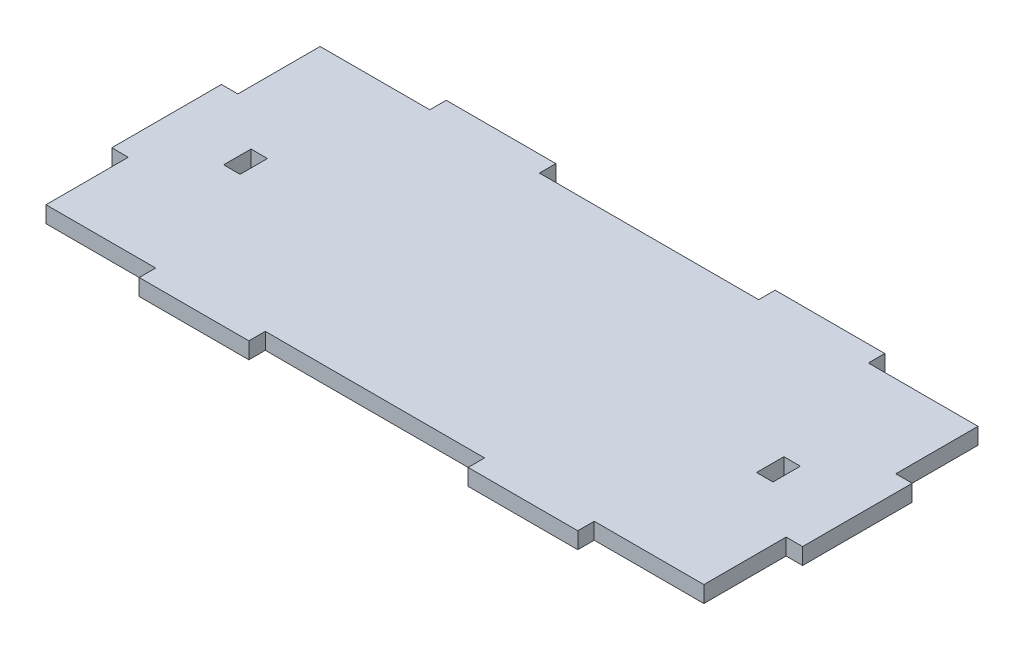
ISO-10303-21;
HEADER;
FILE_DESCRIPTION(('STEP AP214'),'2;1');
FILE_NAME('part.step','',(''),(''),'','','');
FILE_SCHEMA(('AUTOMOTIVE_DESIGN { 1 0 10303 214 1 1 1 1 }'));
ENDSEC;
DATA;
#1=APPLICATION_CONTEXT('core data for automotive mechanical design processes');
#2=APPLICATION_PROTOCOL_DEFINITION('international standard','automotive_design',2000,#1);
#3=PRODUCT_CONTEXT('',#1,'mechanical');
#4=PRODUCT('Part','Part','',(#3));
#5=PRODUCT_RELATED_PRODUCT_CATEGORY('part','',(#4));
#6=PRODUCT_DEFINITION_FORMATION('','',#4);
#7=PRODUCT_DEFINITION_CONTEXT('part definition',#1,'design');
#8=PRODUCT_DEFINITION('design','',#6,#7);
#9=PRODUCT_DEFINITION_SHAPE('','',#8);
#10=(LENGTH_UNIT() NAMED_UNIT(*) SI_UNIT(.MILLI.,.METRE.));
#11=(NAMED_UNIT(*) PLANE_ANGLE_UNIT() SI_UNIT($,.RADIAN.));
#12=(NAMED_UNIT(*) SI_UNIT($,.STERADIAN.) SOLID_ANGLE_UNIT());
#13=UNCERTAINTY_MEASURE_WITH_UNIT(LENGTH_MEASURE(1.E-05),#10,'distance_accuracy_value','');
#14=(GEOMETRIC_REPRESENTATION_CONTEXT(3) GLOBAL_UNCERTAINTY_ASSIGNED_CONTEXT((#13)) GLOBAL_UNIT_ASSIGNED_CONTEXT((#10,
#11,#12)) REPRESENTATION_CONTEXT('',''));
#15=CARTESIAN_POINT('',(0.,0.,0.));
#16=DIRECTION('',(0.,0.,1.));
#17=DIRECTION('',(1.,0.,0.));
#18=AXIS2_PLACEMENT_3D('',#15,#16,#17);
#19=CARTESIAN_POINT('',(0.,3.,0.));
#20=DIRECTION('',(0.,1.,0.));
#21=DIRECTION('',(0.,0.,1.));
#22=AXIS2_PLACEMENT_3D('',#19,#20,#21);
#23=PLANE('',#22);
#24=DIRECTION('',(0.,0.,1.));
#25=VECTOR('',#24,1.);
#26=CARTESIAN_POINT('',(0.,3.,0.));
#27=LINE('',#26,#25);
#28=CARTESIAN_POINT('',(0.,3.,-15.));
#29=VERTEX_POINT('',#28);
#30=CARTESIAN_POINT('',(0.,3.,0.));
#31=VERTEX_POINT('',#30);
#32=EDGE_CURVE('E339',#29,#31,#27,.T.);
#33=ORIENTED_EDGE('',*,*,#32,.T.);
#34=DIRECTION('',(1.,0.,0.));
#35=VECTOR('',#34,1.);
#36=CARTESIAN_POINT('',(0.,3.,0.));
#37=LINE('',#36,#35);
#38=CARTESIAN_POINT('',(20.,3.,0.));
#39=VERTEX_POINT('',#38);
#40=EDGE_CURVE('E342',#31,#39,#37,.T.);
#41=ORIENTED_EDGE('',*,*,#40,.T.);
#42=DIRECTION('',(0.,0.,1.));
#43=VECTOR('',#42,1.);
#44=CARTESIAN_POINT('',(20.,3.,3.00000000000001));
#45=LINE('',#44,#43);
#46=CARTESIAN_POINT('',(20.,3.,3.00000000000001));
#47=VERTEX_POINT('',#46);
#48=EDGE_CURVE('E345',#39,#47,#45,.T.);
#49=ORIENTED_EDGE('',*,*,#48,.T.);
#50=DIRECTION('',(1.,0.,0.));
#51=VECTOR('',#50,1.);
#52=CARTESIAN_POINT('',(20.,3.,3.00000000000001));
#53=LINE('',#52,#51);
#54=CARTESIAN_POINT('',(40.,3.,3.00000000000001));
#55=VERTEX_POINT('',#54);
#56=EDGE_CURVE('E347',#47,#55,#53,.T.);
#57=ORIENTED_EDGE('',*,*,#56,.T.);
#58=DIRECTION('',(0.,0.,-1.));
#59=VECTOR('',#58,1.);
#60=CARTESIAN_POINT('',(40.,3.,3.00000000000001));
#61=LINE('',#60,#59);
#62=CARTESIAN_POINT('',(40.,3.,0.));
#63=VERTEX_POINT('',#62);
#64=EDGE_CURVE('E349',#55,#63,#61,.T.);
#65=ORIENTED_EDGE('',*,*,#64,.T.);
#66=DIRECTION('',(1.,0.,0.));
#67=VECTOR('',#66,1.);
#68=CARTESIAN_POINT('',(40.,3.,0.));
#69=LINE('',#68,#67);
#70=CARTESIAN_POINT('',(80.,3.,0.));
#71=VERTEX_POINT('',#70);
#72=EDGE_CURVE('E351',#63,#71,#69,.T.);
#73=ORIENTED_EDGE('',*,*,#72,.T.);
#74=DIRECTION('',(0.,0.,1.));
#75=VECTOR('',#74,1.);
#76=CARTESIAN_POINT('',(80.,3.,3.00000000000001));
#77=LINE('',#76,#75);
#78=CARTESIAN_POINT('',(80.,3.,3.00000000000001));
#79=VERTEX_POINT('',#78);
#80=EDGE_CURVE('E353',#71,#79,#77,.T.);
#81=ORIENTED_EDGE('',*,*,#80,.T.);
#82=DIRECTION('',(1.,0.,0.));
#83=VECTOR('',#82,1.);
#84=CARTESIAN_POINT('',(100.,3.,3.00000000000001));
#85=LINE('',#84,#83);
#86=CARTESIAN_POINT('',(100.,3.,3.00000000000001));
#87=VERTEX_POINT('',#86);
#88=EDGE_CURVE('E355',#79,#87,#85,.T.);
#89=ORIENTED_EDGE('',*,*,#88,.T.);
#90=DIRECTION('',(0.,0.,-1.));
#91=VECTOR('',#90,1.);
#92=CARTESIAN_POINT('',(100.,3.,3.00000000000001));
#93=LINE('',#92,#91);
#94=CARTESIAN_POINT('',(100.,3.,0.));
#95=VERTEX_POINT('',#94);
#96=EDGE_CURVE('E357',#87,#95,#93,.T.);
#97=ORIENTED_EDGE('',*,*,#96,.T.);
#98=DIRECTION('',(1.,0.,0.));
#99=VECTOR('',#98,1.);
#100=CARTESIAN_POINT('',(100.,3.,0.));
#101=LINE('',#100,#99);
#102=CARTESIAN_POINT('',(120.,3.,0.));
#103=VERTEX_POINT('',#102);
#104=EDGE_CURVE('E359',#95,#103,#101,.T.);
#105=ORIENTED_EDGE('',*,*,#104,.T.);
#106=DIRECTION('',(0.,0.,-1.));
#107=VECTOR('',#106,1.);
#108=CARTESIAN_POINT('',(120.,3.,0.));
#109=LINE('',#108,#107);
#110=CARTESIAN_POINT('',(120.,3.,-15.));
#111=VERTEX_POINT('',#110);
#112=EDGE_CURVE('E361',#103,#111,#109,.T.);
#113=ORIENTED_EDGE('',*,*,#112,.T.);
#114=DIRECTION('',(1.,0.,0.));
#115=VECTOR('',#114,1.);
#116=CARTESIAN_POINT('',(120.,3.,-15.));
#117=LINE('',#116,#115);
#118=CARTESIAN_POINT('',(123.,3.,-15.));
#119=VERTEX_POINT('',#118);
#120=EDGE_CURVE('E363',#111,#119,#117,.T.);
#121=ORIENTED_EDGE('',*,*,#120,.T.);
#122=DIRECTION('',(0.,0.,-1.));
#123=VECTOR('',#122,1.);
#124=CARTESIAN_POINT('',(123.,3.,-15.));
#125=LINE('',#124,#123);
#126=CARTESIAN_POINT('',(123.,3.,-35.));
#127=VERTEX_POINT('',#126);
#128=EDGE_CURVE('E365',#119,#127,#125,.T.);
#129=ORIENTED_EDGE('',*,*,#128,.T.);
#130=DIRECTION('',(-1.,0.,0.));
#131=VECTOR('',#130,1.);
#132=CARTESIAN_POINT('',(120.,3.,-35.));
#133=LINE('',#132,#131);
#134=CARTESIAN_POINT('',(120.,3.,-35.));
#135=VERTEX_POINT('',#134);
#136=EDGE_CURVE('E367',#127,#135,#133,.T.);
#137=ORIENTED_EDGE('',*,*,#136,.T.);
#138=DIRECTION('',(0.,0.,-1.));
#139=VECTOR('',#138,1.);
#140=CARTESIAN_POINT('',(120.,3.,-35.));
#141=LINE('',#140,#139);
#142=CARTESIAN_POINT('',(120.,3.,-50.));
#143=VERTEX_POINT('',#142);
#144=EDGE_CURVE('E369',#135,#143,#141,.T.);
#145=ORIENTED_EDGE('',*,*,#144,.T.);
#146=DIRECTION('',(-1.,0.,0.));
#147=VECTOR('',#146,1.);
#148=CARTESIAN_POINT('',(100.,3.,-50.));
#149=LINE('',#148,#147);
#150=CARTESIAN_POINT('',(100.,3.,-50.));
#151=VERTEX_POINT('',#150);
#152=EDGE_CURVE('E371',#143,#151,#149,.T.);
#153=ORIENTED_EDGE('',*,*,#152,.T.);
#154=DIRECTION('',(0.,0.,-1.));
#155=VECTOR('',#154,1.);
#156=CARTESIAN_POINT('',(100.,3.,-53.));
#157=LINE('',#156,#155);
#158=CARTESIAN_POINT('',(100.,3.,-53.));
#159=VERTEX_POINT('',#158);
#160=EDGE_CURVE('E373',#151,#159,#157,.T.);
#161=ORIENTED_EDGE('',*,*,#160,.T.);
#162=DIRECTION('',(-1.,0.,0.));
#163=VECTOR('',#162,1.);
#164=CARTESIAN_POINT('',(100.,3.,-53.));
#165=LINE('',#164,#163);
#166=CARTESIAN_POINT('',(80.,3.,-53.));
#167=VERTEX_POINT('',#166);
#168=EDGE_CURVE('E375',#159,#167,#165,.T.);
#169=ORIENTED_EDGE('',*,*,#168,.T.);
#170=DIRECTION('',(0.,0.,1.));
#171=VECTOR('',#170,1.);
#172=CARTESIAN_POINT('',(80.,3.,-53.));
#173=LINE('',#172,#171);
#174=CARTESIAN_POINT('',(80.,3.,-50.));
#175=VERTEX_POINT('',#174);
#176=EDGE_CURVE('E377',#167,#175,#173,.T.);
#177=ORIENTED_EDGE('',*,*,#176,.T.);
#178=DIRECTION('',(-1.,0.,0.));
#179=VECTOR('',#178,1.);
#180=CARTESIAN_POINT('',(40.,3.,-50.));
#181=LINE('',#180,#179);
#182=CARTESIAN_POINT('',(40.,3.,-50.));
#183=VERTEX_POINT('',#182);
#184=EDGE_CURVE('E379',#175,#183,#181,.T.);
#185=ORIENTED_EDGE('',*,*,#184,.T.);
#186=DIRECTION('',(0.,0.,-1.));
#187=VECTOR('',#186,1.);
#188=CARTESIAN_POINT('',(40.,3.,-53.));
#189=LINE('',#188,#187);
#190=CARTESIAN_POINT('',(40.,3.,-53.));
#191=VERTEX_POINT('',#190);
#192=EDGE_CURVE('E381',#183,#191,#189,.T.);
#193=ORIENTED_EDGE('',*,*,#192,.T.);
#194=DIRECTION('',(-1.,0.,0.));
#195=VECTOR('',#194,1.);
#196=CARTESIAN_POINT('',(20.,3.,-53.));
#197=LINE('',#196,#195);
#198=CARTESIAN_POINT('',(20.,3.,-53.));
#199=VERTEX_POINT('',#198);
#200=EDGE_CURVE('E383',#191,#199,#197,.T.);
#201=ORIENTED_EDGE('',*,*,#200,.T.);
#202=DIRECTION('',(0.,0.,1.));
#203=VECTOR('',#202,1.);
#204=CARTESIAN_POINT('',(20.,3.,-53.));
#205=LINE('',#204,#203);
#206=CARTESIAN_POINT('',(20.,3.,-50.));
#207=VERTEX_POINT('',#206);
#208=EDGE_CURVE('E385',#199,#207,#205,.T.);
#209=ORIENTED_EDGE('',*,*,#208,.T.);
#210=DIRECTION('',(-1.,0.,0.));
#211=VECTOR('',#210,1.);
#212=CARTESIAN_POINT('',(0.,3.,-50.));
#213=LINE('',#212,#211);
#214=CARTESIAN_POINT('',(0.,3.,-50.));
#215=VERTEX_POINT('',#214);
#216=EDGE_CURVE('E387',#207,#215,#213,.T.);
#217=ORIENTED_EDGE('',*,*,#216,.T.);
#218=DIRECTION('',(0.,0.,1.));
#219=VECTOR('',#218,1.);
#220=CARTESIAN_POINT('',(0.,3.,-35.));
#221=LINE('',#220,#219);
#222=CARTESIAN_POINT('',(0.,3.,-35.));
#223=VERTEX_POINT('',#222);
#224=EDGE_CURVE('E389',#215,#223,#221,.T.);
#225=ORIENTED_EDGE('',*,*,#224,.T.);
#226=DIRECTION('',(-1.,0.,0.));
#227=VECTOR('',#226,1.);
#228=CARTESIAN_POINT('',(0.,3.,-35.));
#229=LINE('',#228,#227);
#230=CARTESIAN_POINT('',(-3.,3.,-35.));
#231=VERTEX_POINT('',#230);
#232=EDGE_CURVE('E391',#223,#231,#229,.T.);
#233=ORIENTED_EDGE('',*,*,#232,.T.);
#234=DIRECTION('',(0.,0.,1.));
#235=VECTOR('',#234,1.);
#236=CARTESIAN_POINT('',(-3.,3.,-15.));
#237=LINE('',#236,#235);
#238=CARTESIAN_POINT('',(-3.,3.,-15.));
#239=VERTEX_POINT('',#238);
#240=EDGE_CURVE('E393',#231,#239,#237,.T.);
#241=ORIENTED_EDGE('',*,*,#240,.T.);
#242=DIRECTION('',(1.,0.,0.));
#243=VECTOR('',#242,1.);
#244=CARTESIAN_POINT('',(0.,3.,-15.));
#245=LINE('',#244,#243);
#246=EDGE_CURVE('E395',#239,#29,#245,.T.);
#247=ORIENTED_EDGE('',*,*,#246,.T.);
#248=EDGE_LOOP('',(#33,#41,#49,#57,#65,#73,#81,#89,#97,#105,#113,#121,#129,#137,#145,#153,#161,
#169,#177,#185,#193,#201,#209,#217,#225,#233,#241,#247));
#249=FACE_BOUND('',#248,.T.);
#250=DIRECTION('',(-1.,0.,0.));
#251=VECTOR('',#250,1.);
#252=CARTESIAN_POINT('',(9.9,3.,-27.5));
#253=LINE('',#252,#251);
#254=CARTESIAN_POINT('',(12.9,3.,-27.5));
#255=VERTEX_POINT('',#254);
#256=CARTESIAN_POINT('',(9.9,3.,-27.5));
#257=VERTEX_POINT('',#256);
#258=EDGE_CURVE('E310',#255,#257,#253,.T.);
#259=ORIENTED_EDGE('',*,*,#258,.F.);
#260=DIRECTION('',(0.,0.,-1.));
#261=VECTOR('',#260,1.);
#262=CARTESIAN_POINT('',(12.9,3.,-27.5));
#263=LINE('',#262,#261);
#264=CARTESIAN_POINT('',(12.9,3.,-22.5));
#265=VERTEX_POINT('',#264);
#266=EDGE_CURVE('E308',#265,#255,#263,.T.);
#267=ORIENTED_EDGE('',*,*,#266,.F.);
#268=DIRECTION('',(1.,0.,0.));
#269=VECTOR('',#268,1.);
#270=CARTESIAN_POINT('',(9.9,3.,-22.5));
#271=LINE('',#270,#269);
#272=CARTESIAN_POINT('',(9.9,3.,-22.5));
#273=VERTEX_POINT('',#272);
#274=EDGE_CURVE('E316',#273,#265,#271,.T.);
#275=ORIENTED_EDGE('',*,*,#274,.F.);
#276=DIRECTION('',(0.,0.,1.));
#277=VECTOR('',#276,1.);
#278=CARTESIAN_POINT('',(9.9,3.,-27.5));
#279=LINE('',#278,#277);
#280=EDGE_CURVE('E313',#257,#273,#279,.T.);
#281=ORIENTED_EDGE('',*,*,#280,.F.);
#282=EDGE_LOOP('',(#259,#267,#275,#281));
#283=FACE_BOUND('',#282,.T.);
#284=DIRECTION('',(-1.,0.,0.));
#285=VECTOR('',#284,1.);
#286=CARTESIAN_POINT('',(110.1,3.,-27.5));
#287=LINE('',#286,#285);
#288=CARTESIAN_POINT('',(110.1,3.,-27.5));
#289=VERTEX_POINT('',#288);
#290=CARTESIAN_POINT('',(107.1,3.,-27.5));
#291=VERTEX_POINT('',#290);
#292=EDGE_CURVE('E280',#289,#291,#287,.T.);
#293=ORIENTED_EDGE('',*,*,#292,.F.);
#294=DIRECTION('',(0.,0.,-1.));
#295=VECTOR('',#294,1.);
#296=CARTESIAN_POINT('',(110.1,3.,-27.5));
#297=LINE('',#296,#295);
#298=CARTESIAN_POINT('',(110.1,3.,-22.5));
#299=VERTEX_POINT('',#298);
#300=EDGE_CURVE('E272',#299,#289,#297,.T.);
#301=ORIENTED_EDGE('',*,*,#300,.F.);
#302=DIRECTION('',(1.,0.,0.));
#303=VECTOR('',#302,1.);
#304=CARTESIAN_POINT('',(110.1,3.,-22.5));
#305=LINE('',#304,#303);
#306=CARTESIAN_POINT('',(107.1,3.,-22.5));
#307=VERTEX_POINT('',#306);
#308=EDGE_CURVE('E294',#307,#299,#305,.T.);
#309=ORIENTED_EDGE('',*,*,#308,.F.);
#310=DIRECTION('',(0.,0.,1.));
#311=VECTOR('',#310,1.);
#312=CARTESIAN_POINT('',(107.1,3.,-27.5));
#313=LINE('',#312,#311);
#314=EDGE_CURVE('E292',#291,#307,#313,.T.);
#315=ORIENTED_EDGE('',*,*,#314,.F.);
#316=EDGE_LOOP('',(#293,#301,#309,#315));
#317=FACE_BOUND('',#316,.T.);
#318=ADVANCED_FACE('F39',(#249,#283,#317),#23,.T.);
#319=CARTESIAN_POINT('',(0.,0.,0.));
#320=DIRECTION('',(0.,1.,0.));
#321=DIRECTION('',(0.,0.,1.));
#322=AXIS2_PLACEMENT_3D('',#319,#320,#321);
#323=PLANE('',#322);
#324=DIRECTION('',(0.,0.,-1.));
#325=VECTOR('',#324,1.);
#326=CARTESIAN_POINT('',(12.9,0.,-27.5));
#327=LINE('',#326,#325);
#328=CARTESIAN_POINT('',(12.9,0.,-22.5));
#329=VERTEX_POINT('',#328);
#330=CARTESIAN_POINT('',(12.9,0.,-27.5));
#331=VERTEX_POINT('',#330);
#332=EDGE_CURVE('E288',#329,#331,#327,.T.);
#333=ORIENTED_EDGE('',*,*,#332,.T.);
#334=DIRECTION('',(-1.,0.,0.));
#335=VECTOR('',#334,1.);
#336=CARTESIAN_POINT('',(9.9,0.,-27.5));
#337=LINE('',#336,#335);
#338=CARTESIAN_POINT('',(9.9,0.,-27.5));
#339=VERTEX_POINT('',#338);
#340=EDGE_CURVE('E321',#331,#339,#337,.T.);
#341=ORIENTED_EDGE('',*,*,#340,.T.);
#342=DIRECTION('',(0.,0.,1.));
#343=VECTOR('',#342,1.);
#344=CARTESIAN_POINT('',(9.9,0.,-27.5));
#345=LINE('',#344,#343);
#346=CARTESIAN_POINT('',(9.9,0.,-22.5));
#347=VERTEX_POINT('',#346);
#348=EDGE_CURVE('E324',#339,#347,#345,.T.);
#349=ORIENTED_EDGE('',*,*,#348,.T.);
#350=DIRECTION('',(1.,0.,0.));
#351=VECTOR('',#350,1.);
#352=CARTESIAN_POINT('',(9.9,0.,-22.5));
#353=LINE('',#352,#351);
#354=EDGE_CURVE('E311',#347,#329,#353,.T.);
#355=ORIENTED_EDGE('',*,*,#354,.T.);
#356=EDGE_LOOP('',(#333,#341,#349,#355));
#357=FACE_BOUND('',#356,.T.);
#358=DIRECTION('',(0.,0.,1.));
#359=VECTOR('',#358,1.);
#360=CARTESIAN_POINT('',(0.,0.,0.));
#361=LINE('',#360,#359);
#362=CARTESIAN_POINT('',(0.,0.,-15.));
#363=VERTEX_POINT('',#362);
#364=CARTESIAN_POINT('',(0.,0.,0.));
#365=VERTEX_POINT('',#364);
#366=EDGE_CURVE('E338',#363,#365,#361,.T.);
#367=ORIENTED_EDGE('',*,*,#366,.F.);
#368=DIRECTION('',(1.,0.,0.));
#369=VECTOR('',#368,1.);
#370=CARTESIAN_POINT('',(0.,0.,-15.));
#371=LINE('',#370,#369);
#372=CARTESIAN_POINT('',(-3.,0.,-15.));
#373=VERTEX_POINT('',#372);
#374=EDGE_CURVE('E343',#373,#363,#371,.T.);
#375=ORIENTED_EDGE('',*,*,#374,.F.);
#376=DIRECTION('',(0.,0.,1.));
#377=VECTOR('',#376,1.);
#378=CARTESIAN_POINT('',(-3.,0.,-15.));
#379=LINE('',#378,#377);
#380=CARTESIAN_POINT('',(-3.,0.,-35.));
#381=VERTEX_POINT('',#380);
#382=EDGE_CURVE('E450',#381,#373,#379,.T.);
#383=ORIENTED_EDGE('',*,*,#382,.F.);
#384=DIRECTION('',(-1.,0.,0.));
#385=VECTOR('',#384,1.);
#386=CARTESIAN_POINT('',(0.,0.,-35.));
#387=LINE('',#386,#385);
#388=CARTESIAN_POINT('',(0.,0.,-35.));
#389=VERTEX_POINT('',#388);
#390=EDGE_CURVE('E448',#389,#381,#387,.T.);
#391=ORIENTED_EDGE('',*,*,#390,.F.);
#392=DIRECTION('',(0.,0.,1.));
#393=VECTOR('',#392,1.);
#394=CARTESIAN_POINT('',(0.,0.,-35.));
#395=LINE('',#394,#393);
#396=CARTESIAN_POINT('',(0.,0.,-50.));
#397=VERTEX_POINT('',#396);
#398=EDGE_CURVE('E446',#397,#389,#395,.T.);
#399=ORIENTED_EDGE('',*,*,#398,.F.);
#400=DIRECTION('',(-1.,0.,0.));
#401=VECTOR('',#400,1.);
#402=CARTESIAN_POINT('',(0.,0.,-50.));
#403=LINE('',#402,#401);
#404=CARTESIAN_POINT('',(20.,0.,-50.));
#405=VERTEX_POINT('',#404);
#406=EDGE_CURVE('E444',#405,#397,#403,.T.);
#407=ORIENTED_EDGE('',*,*,#406,.F.);
#408=DIRECTION('',(0.,0.,1.));
#409=VECTOR('',#408,1.);
#410=CARTESIAN_POINT('',(20.,0.,-53.));
#411=LINE('',#410,#409);
#412=CARTESIAN_POINT('',(20.,0.,-53.));
#413=VERTEX_POINT('',#412);
#414=EDGE_CURVE('E442',#413,#405,#411,.T.);
#415=ORIENTED_EDGE('',*,*,#414,.F.);
#416=DIRECTION('',(-1.,0.,0.));
#417=VECTOR('',#416,1.);
#418=CARTESIAN_POINT('',(20.,0.,-53.));
#419=LINE('',#418,#417);
#420=CARTESIAN_POINT('',(40.,0.,-53.));
#421=VERTEX_POINT('',#420);
#422=EDGE_CURVE('E440',#421,#413,#419,.T.);
#423=ORIENTED_EDGE('',*,*,#422,.F.);
#424=DIRECTION('',(0.,0.,-1.));
#425=VECTOR('',#424,1.);
#426=CARTESIAN_POINT('',(40.,0.,-53.));
#427=LINE('',#426,#425);
#428=CARTESIAN_POINT('',(40.,0.,-50.));
#429=VERTEX_POINT('',#428);
#430=EDGE_CURVE('E438',#429,#421,#427,.T.);
#431=ORIENTED_EDGE('',*,*,#430,.F.);
#432=DIRECTION('',(-1.,0.,0.));
#433=VECTOR('',#432,1.);
#434=CARTESIAN_POINT('',(40.,0.,-50.));
#435=LINE('',#434,#433);
#436=CARTESIAN_POINT('',(80.,0.,-50.));
#437=VERTEX_POINT('',#436);
#438=EDGE_CURVE('E436',#437,#429,#435,.T.);
#439=ORIENTED_EDGE('',*,*,#438,.F.);
#440=DIRECTION('',(0.,0.,1.));
#441=VECTOR('',#440,1.);
#442=CARTESIAN_POINT('',(80.,0.,-53.));
#443=LINE('',#442,#441);
#444=CARTESIAN_POINT('',(80.,0.,-53.));
#445=VERTEX_POINT('',#444);
#446=EDGE_CURVE('E434',#445,#437,#443,.T.);
#447=ORIENTED_EDGE('',*,*,#446,.F.);
#448=DIRECTION('',(-1.,0.,0.));
#449=VECTOR('',#448,1.);
#450=CARTESIAN_POINT('',(100.,0.,-53.));
#451=LINE('',#450,#449);
#452=CARTESIAN_POINT('',(100.,0.,-53.));
#453=VERTEX_POINT('',#452);
#454=EDGE_CURVE('E432',#453,#445,#451,.T.);
#455=ORIENTED_EDGE('',*,*,#454,.F.);
#456=DIRECTION('',(0.,0.,-1.));
#457=VECTOR('',#456,1.);
#458=CARTESIAN_POINT('',(100.,0.,-53.));
#459=LINE('',#458,#457);
#460=CARTESIAN_POINT('',(100.,0.,-50.));
#461=VERTEX_POINT('',#460);
#462=EDGE_CURVE('E430',#461,#453,#459,.T.);
#463=ORIENTED_EDGE('',*,*,#462,.F.);
#464=DIRECTION('',(-1.,0.,0.));
#465=VECTOR('',#464,1.);
#466=CARTESIAN_POINT('',(100.,0.,-50.));
#467=LINE('',#466,#465);
#468=CARTESIAN_POINT('',(120.,0.,-50.));
#469=VERTEX_POINT('',#468);
#470=EDGE_CURVE('E428',#469,#461,#467,.T.);
#471=ORIENTED_EDGE('',*,*,#470,.F.);
#472=DIRECTION('',(0.,0.,-1.));
#473=VECTOR('',#472,1.);
#474=CARTESIAN_POINT('',(120.,0.,-35.));
#475=LINE('',#474,#473);
#476=CARTESIAN_POINT('',(120.,0.,-35.));
#477=VERTEX_POINT('',#476);
#478=EDGE_CURVE('E426',#477,#469,#475,.T.);
#479=ORIENTED_EDGE('',*,*,#478,.F.);
#480=DIRECTION('',(-1.,0.,0.));
#481=VECTOR('',#480,1.);
#482=CARTESIAN_POINT('',(120.,0.,-35.));
#483=LINE('',#482,#481);
#484=CARTESIAN_POINT('',(123.,0.,-35.));
#485=VERTEX_POINT('',#484);
#486=EDGE_CURVE('E424',#485,#477,#483,.T.);
#487=ORIENTED_EDGE('',*,*,#486,.F.);
#488=DIRECTION('',(0.,0.,-1.));
#489=VECTOR('',#488,1.);
#490=CARTESIAN_POINT('',(123.,0.,-15.));
#491=LINE('',#490,#489);
#492=CARTESIAN_POINT('',(123.,0.,-15.));
#493=VERTEX_POINT('',#492);
#494=EDGE_CURVE('E422',#493,#485,#491,.T.);
#495=ORIENTED_EDGE('',*,*,#494,.F.);
#496=DIRECTION('',(1.,0.,0.));
#497=VECTOR('',#496,1.);
#498=CARTESIAN_POINT('',(120.,0.,-15.));
#499=LINE('',#498,#497);
#500=CARTESIAN_POINT('',(120.,0.,-15.));
#501=VERTEX_POINT('',#500);
#502=EDGE_CURVE('E420',#501,#493,#499,.T.);
#503=ORIENTED_EDGE('',*,*,#502,.F.);
#504=DIRECTION('',(0.,0.,-1.));
#505=VECTOR('',#504,1.);
#506=CARTESIAN_POINT('',(120.,0.,0.));
#507=LINE('',#506,#505);
#508=CARTESIAN_POINT('',(120.,0.,0.));
#509=VERTEX_POINT('',#508);
#510=EDGE_CURVE('E418',#509,#501,#507,.T.);
#511=ORIENTED_EDGE('',*,*,#510,.F.);
#512=DIRECTION('',(1.,0.,0.));
#513=VECTOR('',#512,1.);
#514=CARTESIAN_POINT('',(100.,0.,0.));
#515=LINE('',#514,#513);
#516=CARTESIAN_POINT('',(100.,0.,0.));
#517=VERTEX_POINT('',#516);
#518=EDGE_CURVE('E416',#517,#509,#515,.T.);
#519=ORIENTED_EDGE('',*,*,#518,.F.);
#520=DIRECTION('',(0.,0.,-1.));
#521=VECTOR('',#520,1.);
#522=CARTESIAN_POINT('',(100.,0.,3.00000000000001));
#523=LINE('',#522,#521);
#524=CARTESIAN_POINT('',(100.,0.,3.00000000000001));
#525=VERTEX_POINT('',#524);
#526=EDGE_CURVE('E414',#525,#517,#523,.T.);
#527=ORIENTED_EDGE('',*,*,#526,.F.);
#528=DIRECTION('',(1.,0.,0.));
#529=VECTOR('',#528,1.);
#530=CARTESIAN_POINT('',(100.,0.,3.00000000000001));
#531=LINE('',#530,#529);
#532=CARTESIAN_POINT('',(80.,0.,3.00000000000001));
#533=VERTEX_POINT('',#532);
#534=EDGE_CURVE('E412',#533,#525,#531,.T.);
#535=ORIENTED_EDGE('',*,*,#534,.F.);
#536=DIRECTION('',(0.,0.,1.));
#537=VECTOR('',#536,1.);
#538=CARTESIAN_POINT('',(80.,0.,3.00000000000001));
#539=LINE('',#538,#537);
#540=CARTESIAN_POINT('',(80.,0.,0.));
#541=VERTEX_POINT('',#540);
#542=EDGE_CURVE('E410',#541,#533,#539,.T.);
#543=ORIENTED_EDGE('',*,*,#542,.F.);
#544=DIRECTION('',(1.,0.,0.));
#545=VECTOR('',#544,1.);
#546=CARTESIAN_POINT('',(40.,0.,0.));
#547=LINE('',#546,#545);
#548=CARTESIAN_POINT('',(40.,0.,0.));
#549=VERTEX_POINT('',#548);
#550=EDGE_CURVE('E408',#549,#541,#547,.T.);
#551=ORIENTED_EDGE('',*,*,#550,.F.);
#552=DIRECTION('',(0.,0.,-1.));
#553=VECTOR('',#552,1.);
#554=CARTESIAN_POINT('',(40.,0.,3.00000000000001));
#555=LINE('',#554,#553);
#556=CARTESIAN_POINT('',(40.,0.,3.00000000000001));
#557=VERTEX_POINT('',#556);
#558=EDGE_CURVE('E406',#557,#549,#555,.T.);
#559=ORIENTED_EDGE('',*,*,#558,.F.);
#560=DIRECTION('',(1.,0.,0.));
#561=VECTOR('',#560,1.);
#562=CARTESIAN_POINT('',(20.,0.,3.00000000000001));
#563=LINE('',#562,#561);
#564=CARTESIAN_POINT('',(20.,0.,3.00000000000001));
#565=VERTEX_POINT('',#564);
#566=EDGE_CURVE('E404',#565,#557,#563,.T.);
#567=ORIENTED_EDGE('',*,*,#566,.F.);
#568=DIRECTION('',(0.,0.,1.));
#569=VECTOR('',#568,1.);
#570=CARTESIAN_POINT('',(20.,0.,3.00000000000001));
#571=LINE('',#570,#569);
#572=CARTESIAN_POINT('',(20.,0.,0.));
#573=VERTEX_POINT('',#572);
#574=EDGE_CURVE('E402',#573,#565,#571,.T.);
#575=ORIENTED_EDGE('',*,*,#574,.F.);
#576=DIRECTION('',(1.,0.,0.));
#577=VECTOR('',#576,1.);
#578=CARTESIAN_POINT('',(0.,0.,0.));
#579=LINE('',#578,#577);
#580=EDGE_CURVE('E400',#365,#573,#579,.T.);
#581=ORIENTED_EDGE('',*,*,#580,.F.);
#582=EDGE_LOOP('',(#367,#375,#383,#391,#399,#407,#415,#423,#431,#439,#447,#455,#463,#471,#479,
#487,#495,#503,#511,#519,#527,#535,#543,#551,#559,#567,#575,#581));
#583=FACE_BOUND('',#582,.T.);
#584=DIRECTION('',(0.,0.,-1.));
#585=VECTOR('',#584,1.);
#586=CARTESIAN_POINT('',(110.1,0.,-27.5));
#587=LINE('',#586,#585);
#588=CARTESIAN_POINT('',(110.1,0.,-22.5));
#589=VERTEX_POINT('',#588);
#590=CARTESIAN_POINT('',(110.1,0.,-27.5));
#591=VERTEX_POINT('',#590);
#592=EDGE_CURVE('E62',#589,#591,#587,.T.);
#593=ORIENTED_EDGE('',*,*,#592,.T.);
#594=DIRECTION('',(-1.,0.,0.));
#595=VECTOR('',#594,1.);
#596=CARTESIAN_POINT('',(110.1,0.,-27.5));
#597=LINE('',#596,#595);
#598=CARTESIAN_POINT('',(107.1,0.,-27.5));
#599=VERTEX_POINT('',#598);
#600=EDGE_CURVE('E287',#591,#599,#597,.T.);
#601=ORIENTED_EDGE('',*,*,#600,.T.);
#602=DIRECTION('',(0.,0.,1.));
#603=VECTOR('',#602,1.);
#604=CARTESIAN_POINT('',(107.1,0.,-27.5));
#605=LINE('',#604,#603);
#606=CARTESIAN_POINT('',(107.1,0.,-22.5));
#607=VERTEX_POINT('',#606);
#608=EDGE_CURVE('E300',#599,#607,#605,.T.);
#609=ORIENTED_EDGE('',*,*,#608,.T.);
#610=DIRECTION('',(1.,0.,0.));
#611=VECTOR('',#610,1.);
#612=CARTESIAN_POINT('',(110.1,0.,-22.5));
#613=LINE('',#612,#611);
#614=EDGE_CURVE('E281',#607,#589,#613,.T.);
#615=ORIENTED_EDGE('',*,*,#614,.T.);
#616=EDGE_LOOP('',(#593,#601,#609,#615));
#617=FACE_BOUND('',#616,.T.);
#618=ADVANCED_FACE('F540',(#357,#583,#617),#323,.F.);
#619=CARTESIAN_POINT('',(0.,3.,0.));
#620=DIRECTION('',(1.,0.,0.));
#621=DIRECTION('',(0.,0.,-1.));
#622=AXIS2_PLACEMENT_3D('',#619,#620,#621);
#623=PLANE('',#622);
#624=ORIENTED_EDGE('',*,*,#366,.T.);
#625=DIRECTION('',(0.,-1.,0.));
#626=VECTOR('',#625,1.);
#627=CARTESIAN_POINT('',(0.,3.,0.));
#628=LINE('',#627,#626);
#629=EDGE_CURVE('E11',#31,#365,#628,.T.);
#630=ORIENTED_EDGE('',*,*,#629,.F.);
#631=ORIENTED_EDGE('',*,*,#32,.F.);
#632=DIRECTION('',(0.,-1.,0.));
#633=VECTOR('',#632,1.);
#634=CARTESIAN_POINT('',(0.,3.,-15.));
#635=LINE('',#634,#633);
#636=EDGE_CURVE('E397',#29,#363,#635,.T.);
#637=ORIENTED_EDGE('',*,*,#636,.T.);
#638=EDGE_LOOP('',(#624,#630,#631,#637));
#639=FACE_BOUND('',#638,.T.);
#640=ADVANCED_FACE('F41',(#639),#623,.F.);
#641=CARTESIAN_POINT('',(0.,3.,0.));
#642=DIRECTION('',(0.,0.,-1.));
#643=DIRECTION('',(-1.,0.,0.));
#644=AXIS2_PLACEMENT_3D('',#641,#642,#643);
#645=PLANE('',#644);
#646=ORIENTED_EDGE('',*,*,#580,.T.);
#647=DIRECTION('',(0.,-1.,0.));
#648=VECTOR('',#647,1.);
#649=CARTESIAN_POINT('',(20.,3.,0.));
#650=LINE('',#649,#648);
#651=EDGE_CURVE('E47',#39,#573,#650,.T.);
#652=ORIENTED_EDGE('',*,*,#651,.F.);
#653=ORIENTED_EDGE('',*,*,#40,.F.);
#654=ORIENTED_EDGE('',*,*,#629,.T.);
#655=EDGE_LOOP('',(#646,#652,#653,#654));
#656=FACE_BOUND('',#655,.T.);
#657=ADVANCED_FACE('F558',(#656),#645,.F.);
#658=CARTESIAN_POINT('',(20.,3.,3.00000000000001));
#659=DIRECTION('',(1.,0.,0.));
#660=DIRECTION('',(0.,0.,-1.));
#661=AXIS2_PLACEMENT_3D('',#658,#659,#660);
#662=PLANE('',#661);
#663=ORIENTED_EDGE('',*,*,#574,.T.);
#664=DIRECTION('',(0.,-1.,0.));
#665=VECTOR('',#664,1.);
#666=CARTESIAN_POINT('',(20.,3.,3.00000000000001));
#667=LINE('',#666,#665);
#668=EDGE_CURVE('E527',#47,#565,#667,.T.);
#669=ORIENTED_EDGE('',*,*,#668,.F.);
#670=ORIENTED_EDGE('',*,*,#48,.F.);
#671=ORIENTED_EDGE('',*,*,#651,.T.);
#672=EDGE_LOOP('',(#663,#669,#670,#671));
#673=FACE_BOUND('',#672,.T.);
#674=ADVANCED_FACE('F534',(#673),#662,.F.);
#675=CARTESIAN_POINT('',(20.,3.,3.00000000000001));
#676=DIRECTION('',(0.,0.,-1.));
#677=DIRECTION('',(-1.,0.,0.));
#678=AXIS2_PLACEMENT_3D('',#675,#676,#677);
#679=PLANE('',#678);
#680=ORIENTED_EDGE('',*,*,#566,.T.);
#681=DIRECTION('',(0.,-1.,0.));
#682=VECTOR('',#681,1.);
#683=CARTESIAN_POINT('',(40.,3.,3.00000000000001));
#684=LINE('',#683,#682);
#685=EDGE_CURVE('E524',#55,#557,#684,.T.);
#686=ORIENTED_EDGE('',*,*,#685,.F.);
#687=ORIENTED_EDGE('',*,*,#56,.F.);
#688=ORIENTED_EDGE('',*,*,#668,.T.);
#689=EDGE_LOOP('',(#680,#686,#687,#688));
#690=FACE_BOUND('',#689,.T.);
#691=ADVANCED_FACE('F546',(#690),#679,.F.);
#692=CARTESIAN_POINT('',(40.,3.,3.00000000000001));
#693=DIRECTION('',(-1.,0.,0.));
#694=DIRECTION('',(0.,0.,1.));
#695=AXIS2_PLACEMENT_3D('',#692,#693,#694);
#696=PLANE('',#695);
#697=ORIENTED_EDGE('',*,*,#558,.T.);
#698=DIRECTION('',(0.,-1.,0.));
#699=VECTOR('',#698,1.);
#700=CARTESIAN_POINT('',(40.,3.,0.));
#701=LINE('',#700,#699);
#702=EDGE_CURVE('E521',#63,#549,#701,.T.);
#703=ORIENTED_EDGE('',*,*,#702,.F.);
#704=ORIENTED_EDGE('',*,*,#64,.F.);
#705=ORIENTED_EDGE('',*,*,#685,.T.);
#706=EDGE_LOOP('',(#697,#703,#704,#705));
#707=FACE_BOUND('',#706,.T.);
#708=ADVANCED_FACE('F550',(#707),#696,.F.);
#709=CARTESIAN_POINT('',(40.,3.,0.));
#710=DIRECTION('',(0.,0.,-1.));
#711=DIRECTION('',(-1.,0.,0.));
#712=AXIS2_PLACEMENT_3D('',#709,#710,#711);
#713=PLANE('',#712);
#714=ORIENTED_EDGE('',*,*,#550,.T.);
#715=DIRECTION('',(0.,-1.,0.));
#716=VECTOR('',#715,1.);
#717=CARTESIAN_POINT('',(80.,3.,0.));
#718=LINE('',#717,#716);
#719=EDGE_CURVE('E518',#71,#541,#718,.T.);
#720=ORIENTED_EDGE('',*,*,#719,.F.);
#721=ORIENTED_EDGE('',*,*,#72,.F.);
#722=ORIENTED_EDGE('',*,*,#702,.T.);
#723=EDGE_LOOP('',(#714,#720,#721,#722));
#724=FACE_BOUND('',#723,.T.);
#725=ADVANCED_FACE('F671',(#724),#713,.F.);
#726=CARTESIAN_POINT('',(80.,3.,3.00000000000001));
#727=DIRECTION('',(1.,0.,0.));
#728=DIRECTION('',(0.,0.,-1.));
#729=AXIS2_PLACEMENT_3D('',#726,#727,#728);
#730=PLANE('',#729);
#731=ORIENTED_EDGE('',*,*,#542,.T.);
#732=DIRECTION('',(0.,-1.,0.));
#733=VECTOR('',#732,1.);
#734=CARTESIAN_POINT('',(80.,3.,3.00000000000001));
#735=LINE('',#734,#733);
#736=EDGE_CURVE('E515',#79,#533,#735,.T.);
#737=ORIENTED_EDGE('',*,*,#736,.F.);
#738=ORIENTED_EDGE('',*,*,#80,.F.);
#739=ORIENTED_EDGE('',*,*,#719,.T.);
#740=EDGE_LOOP('',(#731,#737,#738,#739));
#741=FACE_BOUND('',#740,.T.);
#742=ADVANCED_FACE('F668',(#741),#730,.F.);
#743=CARTESIAN_POINT('',(100.,3.,3.00000000000001));
#744=DIRECTION('',(0.,0.,-1.));
#745=DIRECTION('',(-1.,0.,0.));
#746=AXIS2_PLACEMENT_3D('',#743,#744,#745);
#747=PLANE('',#746);
#748=ORIENTED_EDGE('',*,*,#534,.T.);
#749=DIRECTION('',(0.,-1.,0.));
#750=VECTOR('',#749,1.);
#751=CARTESIAN_POINT('',(100.,3.,3.00000000000001));
#752=LINE('',#751,#750);
#753=EDGE_CURVE('E512',#87,#525,#752,.T.);
#754=ORIENTED_EDGE('',*,*,#753,.F.);
#755=ORIENTED_EDGE('',*,*,#88,.F.);
#756=ORIENTED_EDGE('',*,*,#736,.T.);
#757=EDGE_LOOP('',(#748,#754,#755,#756));
#758=FACE_BOUND('',#757,.T.);
#759=ADVANCED_FACE('F664',(#758),#747,.F.);
#760=CARTESIAN_POINT('',(100.,3.,3.00000000000001));
#761=DIRECTION('',(-1.,0.,0.));
#762=DIRECTION('',(0.,0.,1.));
#763=AXIS2_PLACEMENT_3D('',#760,#761,#762);
#764=PLANE('',#763);
#765=ORIENTED_EDGE('',*,*,#526,.T.);
#766=DIRECTION('',(0.,-1.,0.));
#767=VECTOR('',#766,1.);
#768=CARTESIAN_POINT('',(100.,3.,0.));
#769=LINE('',#768,#767);
#770=EDGE_CURVE('E509',#95,#517,#769,.T.);
#771=ORIENTED_EDGE('',*,*,#770,.F.);
#772=ORIENTED_EDGE('',*,*,#96,.F.);
#773=ORIENTED_EDGE('',*,*,#753,.T.);
#774=EDGE_LOOP('',(#765,#771,#772,#773));
#775=FACE_BOUND('',#774,.T.);
#776=ADVANCED_FACE('F660',(#775),#764,.F.);
#777=CARTESIAN_POINT('',(100.,3.,0.));
#778=DIRECTION('',(0.,0.,-1.));
#779=DIRECTION('',(-1.,0.,0.));
#780=AXIS2_PLACEMENT_3D('',#777,#778,#779);
#781=PLANE('',#780);
#782=ORIENTED_EDGE('',*,*,#518,.T.);
#783=DIRECTION('',(0.,-1.,0.));
#784=VECTOR('',#783,1.);
#785=CARTESIAN_POINT('',(120.,3.,0.));
#786=LINE('',#785,#784);
#787=EDGE_CURVE('E506',#103,#509,#786,.T.);
#788=ORIENTED_EDGE('',*,*,#787,.F.);
#789=ORIENTED_EDGE('',*,*,#104,.F.);
#790=ORIENTED_EDGE('',*,*,#770,.T.);
#791=EDGE_LOOP('',(#782,#788,#789,#790));
#792=FACE_BOUND('',#791,.T.);
#793=ADVANCED_FACE('F655',(#792),#781,.F.);
#794=CARTESIAN_POINT('',(120.,3.,0.));
#795=DIRECTION('',(-1.,0.,0.));
#796=DIRECTION('',(0.,0.,1.));
#797=AXIS2_PLACEMENT_3D('',#794,#795,#796);
#798=PLANE('',#797);
#799=ORIENTED_EDGE('',*,*,#510,.T.);
#800=DIRECTION('',(0.,-1.,0.));
#801=VECTOR('',#800,1.);
#802=CARTESIAN_POINT('',(120.,3.,-15.));
#803=LINE('',#802,#801);
#804=EDGE_CURVE('E503',#111,#501,#803,.T.);
#805=ORIENTED_EDGE('',*,*,#804,.F.);
#806=ORIENTED_EDGE('',*,*,#112,.F.);
#807=ORIENTED_EDGE('',*,*,#787,.T.);
#808=EDGE_LOOP('',(#799,#805,#806,#807));
#809=FACE_BOUND('',#808,.T.);
#810=ADVANCED_FACE('F649',(#809),#798,.F.);
#811=CARTESIAN_POINT('',(120.,3.,-15.));
#812=DIRECTION('',(0.,0.,-1.));
#813=DIRECTION('',(-1.,0.,0.));
#814=AXIS2_PLACEMENT_3D('',#811,#812,#813);
#815=PLANE('',#814);
#816=ORIENTED_EDGE('',*,*,#502,.T.);
#817=DIRECTION('',(0.,-1.,0.));
#818=VECTOR('',#817,1.);
#819=CARTESIAN_POINT('',(123.,3.,-15.));
#820=LINE('',#819,#818);
#821=EDGE_CURVE('E500',#119,#493,#820,.T.);
#822=ORIENTED_EDGE('',*,*,#821,.F.);
#823=ORIENTED_EDGE('',*,*,#120,.F.);
#824=ORIENTED_EDGE('',*,*,#804,.T.);
#825=EDGE_LOOP('',(#816,#822,#823,#824));
#826=FACE_BOUND('',#825,.T.);
#827=ADVANCED_FACE('F645',(#826),#815,.F.);
#828=CARTESIAN_POINT('',(123.,3.,-15.));
#829=DIRECTION('',(-1.,0.,0.));
#830=DIRECTION('',(0.,0.,1.));
#831=AXIS2_PLACEMENT_3D('',#828,#829,#830);
#832=PLANE('',#831);
#833=ORIENTED_EDGE('',*,*,#494,.T.);
#834=DIRECTION('',(0.,-1.,0.));
#835=VECTOR('',#834,1.);
#836=CARTESIAN_POINT('',(123.,3.,-35.));
#837=LINE('',#836,#835);
#838=EDGE_CURVE('E497',#127,#485,#837,.T.);
#839=ORIENTED_EDGE('',*,*,#838,.F.);
#840=ORIENTED_EDGE('',*,*,#128,.F.);
#841=ORIENTED_EDGE('',*,*,#821,.T.);
#842=EDGE_LOOP('',(#833,#839,#840,#841));
#843=FACE_BOUND('',#842,.T.);
#844=ADVANCED_FACE('F640',(#843),#832,.F.);
#845=CARTESIAN_POINT('',(120.,3.,-35.));
#846=DIRECTION('',(0.,0.,1.));
#847=DIRECTION('',(1.,0.,0.));
#848=AXIS2_PLACEMENT_3D('',#845,#846,#847);
#849=PLANE('',#848);
#850=ORIENTED_EDGE('',*,*,#486,.T.);
#851=DIRECTION('',(0.,-1.,0.));
#852=VECTOR('',#851,1.);
#853=CARTESIAN_POINT('',(120.,3.,-35.));
#854=LINE('',#853,#852);
#855=EDGE_CURVE('E494',#135,#477,#854,.T.);
#856=ORIENTED_EDGE('',*,*,#855,.F.);
#857=ORIENTED_EDGE('',*,*,#136,.F.);
#858=ORIENTED_EDGE('',*,*,#838,.T.);
#859=EDGE_LOOP('',(#850,#856,#857,#858));
#860=FACE_BOUND('',#859,.T.);
#861=ADVANCED_FACE('F634',(#860),#849,.F.);
#862=CARTESIAN_POINT('',(120.,3.,-35.));
#863=DIRECTION('',(-1.,0.,0.));
#864=DIRECTION('',(0.,0.,1.));
#865=AXIS2_PLACEMENT_3D('',#862,#863,#864);
#866=PLANE('',#865);
#867=ORIENTED_EDGE('',*,*,#478,.T.);
#868=DIRECTION('',(0.,-1.,0.));
#869=VECTOR('',#868,1.);
#870=CARTESIAN_POINT('',(120.,3.,-50.));
#871=LINE('',#870,#869);
#872=EDGE_CURVE('E491',#143,#469,#871,.T.);
#873=ORIENTED_EDGE('',*,*,#872,.F.);
#874=ORIENTED_EDGE('',*,*,#144,.F.);
#875=ORIENTED_EDGE('',*,*,#855,.T.);
#876=EDGE_LOOP('',(#867,#873,#874,#875));
#877=FACE_BOUND('',#876,.T.);
#878=ADVANCED_FACE('F630',(#877),#866,.F.);
#879=CARTESIAN_POINT('',(100.,3.,-50.));
#880=DIRECTION('',(0.,0.,1.));
#881=DIRECTION('',(1.,0.,0.));
#882=AXIS2_PLACEMENT_3D('',#879,#880,#881);
#883=PLANE('',#882);
#884=ORIENTED_EDGE('',*,*,#470,.T.);
#885=DIRECTION('',(0.,-1.,0.));
#886=VECTOR('',#885,1.);
#887=CARTESIAN_POINT('',(100.,3.,-50.));
#888=LINE('',#887,#886);
#889=EDGE_CURVE('E488',#151,#461,#888,.T.);
#890=ORIENTED_EDGE('',*,*,#889,.F.);
#891=ORIENTED_EDGE('',*,*,#152,.F.);
#892=ORIENTED_EDGE('',*,*,#872,.T.);
#893=EDGE_LOOP('',(#884,#890,#891,#892));
#894=FACE_BOUND('',#893,.T.);
#895=ADVANCED_FACE('F625',(#894),#883,.F.);
#896=CARTESIAN_POINT('',(100.,3.,-53.));
#897=DIRECTION('',(-1.,0.,0.));
#898=DIRECTION('',(0.,0.,1.));
#899=AXIS2_PLACEMENT_3D('',#896,#897,#898);
#900=PLANE('',#899);
#901=ORIENTED_EDGE('',*,*,#462,.T.);
#902=DIRECTION('',(0.,-1.,0.));
#903=VECTOR('',#902,1.);
#904=CARTESIAN_POINT('',(100.,3.,-53.));
#905=LINE('',#904,#903);
#906=EDGE_CURVE('E485',#159,#453,#905,.T.);
#907=ORIENTED_EDGE('',*,*,#906,.F.);
#908=ORIENTED_EDGE('',*,*,#160,.F.);
#909=ORIENTED_EDGE('',*,*,#889,.T.);
#910=EDGE_LOOP('',(#901,#907,#908,#909));
#911=FACE_BOUND('',#910,.T.);
#912=ADVANCED_FACE('F619',(#911),#900,.F.);
#913=CARTESIAN_POINT('',(100.,3.,-53.));
#914=DIRECTION('',(0.,0.,1.));
#915=DIRECTION('',(1.,0.,0.));
#916=AXIS2_PLACEMENT_3D('',#913,#914,#915);
#917=PLANE('',#916);
#918=ORIENTED_EDGE('',*,*,#454,.T.);
#919=DIRECTION('',(0.,-1.,0.));
#920=VECTOR('',#919,1.);
#921=CARTESIAN_POINT('',(80.,3.,-53.));
#922=LINE('',#921,#920);
#923=EDGE_CURVE('E482',#167,#445,#922,.T.);
#924=ORIENTED_EDGE('',*,*,#923,.F.);
#925=ORIENTED_EDGE('',*,*,#168,.F.);
#926=ORIENTED_EDGE('',*,*,#906,.T.);
#927=EDGE_LOOP('',(#918,#924,#925,#926));
#928=FACE_BOUND('',#927,.T.);
#929=ADVANCED_FACE('F615',(#928),#917,.F.);
#930=CARTESIAN_POINT('',(80.,3.,-53.));
#931=DIRECTION('',(1.,0.,0.));
#932=DIRECTION('',(0.,0.,-1.));
#933=AXIS2_PLACEMENT_3D('',#930,#931,#932);
#934=PLANE('',#933);
#935=ORIENTED_EDGE('',*,*,#446,.T.);
#936=DIRECTION('',(0.,-1.,0.));
#937=VECTOR('',#936,1.);
#938=CARTESIAN_POINT('',(80.,3.,-50.));
#939=LINE('',#938,#937);
#940=EDGE_CURVE('E479',#175,#437,#939,.T.);
#941=ORIENTED_EDGE('',*,*,#940,.F.);
#942=ORIENTED_EDGE('',*,*,#176,.F.);
#943=ORIENTED_EDGE('',*,*,#923,.T.);
#944=EDGE_LOOP('',(#935,#941,#942,#943));
#945=FACE_BOUND('',#944,.T.);
#946=ADVANCED_FACE('F610',(#945),#934,.F.);
#947=CARTESIAN_POINT('',(40.,3.,-50.));
#948=DIRECTION('',(0.,0.,1.));
#949=DIRECTION('',(1.,0.,0.));
#950=AXIS2_PLACEMENT_3D('',#947,#948,#949);
#951=PLANE('',#950);
#952=ORIENTED_EDGE('',*,*,#438,.T.);
#953=DIRECTION('',(0.,-1.,0.));
#954=VECTOR('',#953,1.);
#955=CARTESIAN_POINT('',(40.,3.,-50.));
#956=LINE('',#955,#954);
#957=EDGE_CURVE('E476',#183,#429,#956,.T.);
#958=ORIENTED_EDGE('',*,*,#957,.F.);
#959=ORIENTED_EDGE('',*,*,#184,.F.);
#960=ORIENTED_EDGE('',*,*,#940,.T.);
#961=EDGE_LOOP('',(#952,#958,#959,#960));
#962=FACE_BOUND('',#961,.T.);
#963=ADVANCED_FACE('F604',(#962),#951,.F.);
#964=CARTESIAN_POINT('',(40.,3.,-53.));
#965=DIRECTION('',(-1.,0.,0.));
#966=DIRECTION('',(0.,0.,1.));
#967=AXIS2_PLACEMENT_3D('',#964,#965,#966);
#968=PLANE('',#967);
#969=ORIENTED_EDGE('',*,*,#430,.T.);
#970=DIRECTION('',(0.,-1.,0.));
#971=VECTOR('',#970,1.);
#972=CARTESIAN_POINT('',(40.,3.,-53.));
#973=LINE('',#972,#971);
#974=EDGE_CURVE('E473',#191,#421,#973,.T.);
#975=ORIENTED_EDGE('',*,*,#974,.F.);
#976=ORIENTED_EDGE('',*,*,#192,.F.);
#977=ORIENTED_EDGE('',*,*,#957,.T.);
#978=EDGE_LOOP('',(#969,#975,#976,#977));
#979=FACE_BOUND('',#978,.T.);
#980=ADVANCED_FACE('F600',(#979),#968,.F.);
#981=CARTESIAN_POINT('',(20.,3.,-53.));
#982=DIRECTION('',(0.,0.,1.));
#983=DIRECTION('',(1.,0.,0.));
#984=AXIS2_PLACEMENT_3D('',#981,#982,#983);
#985=PLANE('',#984);
#986=ORIENTED_EDGE('',*,*,#422,.T.);
#987=DIRECTION('',(0.,-1.,0.));
#988=VECTOR('',#987,1.);
#989=CARTESIAN_POINT('',(20.,3.,-53.));
#990=LINE('',#989,#988);
#991=EDGE_CURVE('E470',#199,#413,#990,.T.);
#992=ORIENTED_EDGE('',*,*,#991,.F.);
#993=ORIENTED_EDGE('',*,*,#200,.F.);
#994=ORIENTED_EDGE('',*,*,#974,.T.);
#995=EDGE_LOOP('',(#986,#992,#993,#994));
#996=FACE_BOUND('',#995,.T.);
#997=ADVANCED_FACE('F595',(#996),#985,.F.);
#998=CARTESIAN_POINT('',(20.,3.,-53.));
#999=DIRECTION('',(1.,0.,0.));
#1000=DIRECTION('',(0.,0.,-1.));
#1001=AXIS2_PLACEMENT_3D('',#998,#999,#1000);
#1002=PLANE('',#1001);
#1003=ORIENTED_EDGE('',*,*,#414,.T.);
#1004=DIRECTION('',(0.,-1.,0.));
#1005=VECTOR('',#1004,1.);
#1006=CARTESIAN_POINT('',(20.,3.,-50.));
#1007=LINE('',#1006,#1005);
#1008=EDGE_CURVE('E467',#207,#405,#1007,.T.);
#1009=ORIENTED_EDGE('',*,*,#1008,.F.);
#1010=ORIENTED_EDGE('',*,*,#208,.F.);
#1011=ORIENTED_EDGE('',*,*,#991,.T.);
#1012=EDGE_LOOP('',(#1003,#1009,#1010,#1011));
#1013=FACE_BOUND('',#1012,.T.);
#1014=ADVANCED_FACE('F589',(#1013),#1002,.F.);
#1015=CARTESIAN_POINT('',(0.,3.,-50.));
#1016=DIRECTION('',(0.,0.,1.));
#1017=DIRECTION('',(1.,0.,0.));
#1018=AXIS2_PLACEMENT_3D('',#1015,#1016,#1017);
#1019=PLANE('',#1018);
#1020=ORIENTED_EDGE('',*,*,#406,.T.);
#1021=DIRECTION('',(0.,-1.,0.));
#1022=VECTOR('',#1021,1.);
#1023=CARTESIAN_POINT('',(0.,3.,-50.));
#1024=LINE('',#1023,#1022);
#1025=EDGE_CURVE('E464',#215,#397,#1024,.T.);
#1026=ORIENTED_EDGE('',*,*,#1025,.F.);
#1027=ORIENTED_EDGE('',*,*,#216,.F.);
#1028=ORIENTED_EDGE('',*,*,#1008,.T.);
#1029=EDGE_LOOP('',(#1020,#1026,#1027,#1028));
#1030=FACE_BOUND('',#1029,.T.);
#1031=ADVANCED_FACE('F585',(#1030),#1019,.F.);
#1032=CARTESIAN_POINT('',(0.,3.,-35.));
#1033=DIRECTION('',(1.,0.,0.));
#1034=DIRECTION('',(0.,0.,-1.));
#1035=AXIS2_PLACEMENT_3D('',#1032,#1033,#1034);
#1036=PLANE('',#1035);
#1037=ORIENTED_EDGE('',*,*,#398,.T.);
#1038=DIRECTION('',(0.,-1.,0.));
#1039=VECTOR('',#1038,1.);
#1040=CARTESIAN_POINT('',(0.,3.,-35.));
#1041=LINE('',#1040,#1039);
#1042=EDGE_CURVE('E461',#223,#389,#1041,.T.);
#1043=ORIENTED_EDGE('',*,*,#1042,.F.);
#1044=ORIENTED_EDGE('',*,*,#224,.F.);
#1045=ORIENTED_EDGE('',*,*,#1025,.T.);
#1046=EDGE_LOOP('',(#1037,#1043,#1044,#1045));
#1047=FACE_BOUND('',#1046,.T.);
#1048=ADVANCED_FACE('F580',(#1047),#1036,.F.);
#1049=CARTESIAN_POINT('',(0.,3.,-35.));
#1050=DIRECTION('',(0.,0.,1.));
#1051=DIRECTION('',(1.,0.,0.));
#1052=AXIS2_PLACEMENT_3D('',#1049,#1050,#1051);
#1053=PLANE('',#1052);
#1054=ORIENTED_EDGE('',*,*,#390,.T.);
#1055=DIRECTION('',(0.,-1.,0.));
#1056=VECTOR('',#1055,1.);
#1057=CARTESIAN_POINT('',(-3.,3.,-35.));
#1058=LINE('',#1057,#1056);
#1059=EDGE_CURVE('E458',#231,#381,#1058,.T.);
#1060=ORIENTED_EDGE('',*,*,#1059,.F.);
#1061=ORIENTED_EDGE('',*,*,#232,.F.);
#1062=ORIENTED_EDGE('',*,*,#1042,.T.);
#1063=EDGE_LOOP('',(#1054,#1060,#1061,#1062));
#1064=FACE_BOUND('',#1063,.T.);
#1065=ADVANCED_FACE('F574',(#1064),#1053,.F.);
#1066=CARTESIAN_POINT('',(-3.,3.,-15.));
#1067=DIRECTION('',(1.,0.,0.));
#1068=DIRECTION('',(0.,0.,-1.));
#1069=AXIS2_PLACEMENT_3D('',#1066,#1067,#1068);
#1070=PLANE('',#1069);
#1071=ORIENTED_EDGE('',*,*,#382,.T.);
#1072=DIRECTION('',(0.,-1.,0.));
#1073=VECTOR('',#1072,1.);
#1074=CARTESIAN_POINT('',(-3.,3.,-15.));
#1075=LINE('',#1074,#1073);
#1076=EDGE_CURVE('E455',#239,#373,#1075,.T.);
#1077=ORIENTED_EDGE('',*,*,#1076,.F.);
#1078=ORIENTED_EDGE('',*,*,#240,.F.);
#1079=ORIENTED_EDGE('',*,*,#1059,.T.);
#1080=EDGE_LOOP('',(#1071,#1077,#1078,#1079));
#1081=FACE_BOUND('',#1080,.T.);
#1082=ADVANCED_FACE('F570',(#1081),#1070,.F.);
#1083=CARTESIAN_POINT('',(0.,3.,-15.));
#1084=DIRECTION('',(0.,0.,-1.));
#1085=DIRECTION('',(-1.,0.,0.));
#1086=AXIS2_PLACEMENT_3D('',#1083,#1084,#1085);
#1087=PLANE('',#1086);
#1088=ORIENTED_EDGE('',*,*,#374,.T.);
#1089=ORIENTED_EDGE('',*,*,#636,.F.);
#1090=ORIENTED_EDGE('',*,*,#246,.F.);
#1091=ORIENTED_EDGE('',*,*,#1076,.T.);
#1092=EDGE_LOOP('',(#1088,#1089,#1090,#1091));
#1093=FACE_BOUND('',#1092,.T.);
#1094=ADVANCED_FACE('F565',(#1093),#1087,.F.);
#1095=CARTESIAN_POINT('',(12.9,3.,-27.5));
#1096=DIRECTION('',(-1.,0.,0.));
#1097=DIRECTION('',(0.,0.,1.));
#1098=AXIS2_PLACEMENT_3D('',#1095,#1096,#1097);
#1099=PLANE('',#1098);
#1100=ORIENTED_EDGE('',*,*,#332,.F.);
#1101=DIRECTION('',(0.,-1.,0.));
#1102=VECTOR('',#1101,1.);
#1103=CARTESIAN_POINT('',(12.9,3.,-22.5));
#1104=LINE('',#1103,#1102);
#1105=EDGE_CURVE('E318',#265,#329,#1104,.T.);
#1106=ORIENTED_EDGE('',*,*,#1105,.F.);
#1107=ORIENTED_EDGE('',*,*,#266,.T.);
#1108=DIRECTION('',(0.,-1.,0.));
#1109=VECTOR('',#1108,1.);
#1110=CARTESIAN_POINT('',(12.9,3.,-27.5));
#1111=LINE('',#1110,#1109);
#1112=EDGE_CURVE('E335',#255,#331,#1111,.T.);
#1113=ORIENTED_EDGE('',*,*,#1112,.T.);
#1114=EDGE_LOOP('',(#1100,#1106,#1107,#1113));
#1115=FACE_BOUND('',#1114,.T.);
#1116=ADVANCED_FACE('F688',(#1115),#1099,.T.);
#1117=CARTESIAN_POINT('',(9.9,3.,-27.5));
#1118=DIRECTION('',(0.,0.,1.));
#1119=DIRECTION('',(1.,0.,0.));
#1120=AXIS2_PLACEMENT_3D('',#1117,#1118,#1119);
#1121=PLANE('',#1120);
#1122=ORIENTED_EDGE('',*,*,#340,.F.);
#1123=ORIENTED_EDGE('',*,*,#1112,.F.);
#1124=ORIENTED_EDGE('',*,*,#258,.T.);
#1125=DIRECTION('',(0.,-1.,0.));
#1126=VECTOR('',#1125,1.);
#1127=CARTESIAN_POINT('',(9.9,3.,-27.5));
#1128=LINE('',#1127,#1126);
#1129=EDGE_CURVE('E333',#257,#339,#1128,.T.);
#1130=ORIENTED_EDGE('',*,*,#1129,.T.);
#1131=EDGE_LOOP('',(#1122,#1123,#1124,#1130));
#1132=FACE_BOUND('',#1131,.T.);
#1133=ADVANCED_FACE('F843',(#1132),#1121,.T.);
#1134=CARTESIAN_POINT('',(9.9,3.,-27.5));
#1135=DIRECTION('',(1.,0.,0.));
#1136=DIRECTION('',(0.,0.,-1.));
#1137=AXIS2_PLACEMENT_3D('',#1134,#1135,#1136);
#1138=PLANE('',#1137);
#1139=ORIENTED_EDGE('',*,*,#348,.F.);
#1140=ORIENTED_EDGE('',*,*,#1129,.F.);
#1141=ORIENTED_EDGE('',*,*,#280,.T.);
#1142=DIRECTION('',(0.,-1.,0.));
#1143=VECTOR('',#1142,1.);
#1144=CARTESIAN_POINT('',(9.9,3.,-22.5));
#1145=LINE('',#1144,#1143);
#1146=EDGE_CURVE('E331',#273,#347,#1145,.T.);
#1147=ORIENTED_EDGE('',*,*,#1146,.T.);
#1148=EDGE_LOOP('',(#1139,#1140,#1141,#1147));
#1149=FACE_BOUND('',#1148,.T.);
#1150=ADVANCED_FACE('F851',(#1149),#1138,.T.);
#1151=CARTESIAN_POINT('',(9.9,3.,-22.5));
#1152=DIRECTION('',(0.,0.,-1.));
#1153=DIRECTION('',(-1.,0.,0.));
#1154=AXIS2_PLACEMENT_3D('',#1151,#1152,#1153);
#1155=PLANE('',#1154);
#1156=ORIENTED_EDGE('',*,*,#354,.F.);
#1157=ORIENTED_EDGE('',*,*,#1146,.F.);
#1158=ORIENTED_EDGE('',*,*,#274,.T.);
#1159=ORIENTED_EDGE('',*,*,#1105,.T.);
#1160=EDGE_LOOP('',(#1156,#1157,#1158,#1159));
#1161=FACE_BOUND('',#1160,.T.);
#1162=ADVANCED_FACE('F859',(#1161),#1155,.T.);
#1163=CARTESIAN_POINT('',(110.1,3.,-27.5));
#1164=DIRECTION('',(-1.,0.,0.));
#1165=DIRECTION('',(0.,0.,1.));
#1166=AXIS2_PLACEMENT_3D('',#1163,#1164,#1165);
#1167=PLANE('',#1166);
#1168=ORIENTED_EDGE('',*,*,#592,.F.);
#1169=DIRECTION('',(0.,-1.,0.));
#1170=VECTOR('',#1169,1.);
#1171=CARTESIAN_POINT('',(110.1,3.,-22.5));
#1172=LINE('',#1171,#1170);
#1173=EDGE_CURVE('E276',#299,#589,#1172,.T.);
#1174=ORIENTED_EDGE('',*,*,#1173,.F.);
#1175=ORIENTED_EDGE('',*,*,#300,.T.);
#1176=DIRECTION('',(0.,-1.,0.));
#1177=VECTOR('',#1176,1.);
#1178=CARTESIAN_POINT('',(110.1,3.,-27.5));
#1179=LINE('',#1178,#1177);
#1180=EDGE_CURVE('E275',#289,#591,#1179,.T.);
#1181=ORIENTED_EDGE('',*,*,#1180,.T.);
#1182=EDGE_LOOP('',(#1168,#1174,#1175,#1181));
#1183=FACE_BOUND('',#1182,.T.);
#1184=ADVANCED_FACE('F274',(#1183),#1167,.T.);
#1185=CARTESIAN_POINT('',(110.1,3.,-27.5));
#1186=DIRECTION('',(0.,0.,1.));
#1187=DIRECTION('',(1.,0.,0.));
#1188=AXIS2_PLACEMENT_3D('',#1185,#1186,#1187);
#1189=PLANE('',#1188);
#1190=ORIENTED_EDGE('',*,*,#600,.F.);
#1191=ORIENTED_EDGE('',*,*,#1180,.F.);
#1192=ORIENTED_EDGE('',*,*,#292,.T.);
#1193=DIRECTION('',(0.,-1.,0.));
#1194=VECTOR('',#1193,1.);
#1195=CARTESIAN_POINT('',(107.1,3.,-27.5));
#1196=LINE('',#1195,#1194);
#1197=EDGE_CURVE('E289',#291,#599,#1196,.T.);
#1198=ORIENTED_EDGE('',*,*,#1197,.T.);
#1199=EDGE_LOOP('',(#1190,#1191,#1192,#1198));
#1200=FACE_BOUND('',#1199,.T.);
#1201=ADVANCED_FACE('F284',(#1200),#1189,.T.);
#1202=CARTESIAN_POINT('',(107.1,3.,-27.5));
#1203=DIRECTION('',(1.,0.,0.));
#1204=DIRECTION('',(0.,0.,-1.));
#1205=AXIS2_PLACEMENT_3D('',#1202,#1203,#1204);
#1206=PLANE('',#1205);
#1207=ORIENTED_EDGE('',*,*,#608,.F.);
#1208=ORIENTED_EDGE('',*,*,#1197,.F.);
#1209=ORIENTED_EDGE('',*,*,#314,.T.);
#1210=DIRECTION('',(0.,-1.,0.));
#1211=VECTOR('',#1210,1.);
#1212=CARTESIAN_POINT('',(107.1,3.,-22.5));
#1213=LINE('',#1212,#1211);
#1214=EDGE_CURVE('E54',#307,#607,#1213,.T.);
#1215=ORIENTED_EDGE('',*,*,#1214,.T.);
#1216=EDGE_LOOP('',(#1207,#1208,#1209,#1215));
#1217=FACE_BOUND('',#1216,.T.);
#1218=ADVANCED_FACE('F883',(#1217),#1206,.T.);
#1219=CARTESIAN_POINT('',(110.1,3.,-22.5));
#1220=DIRECTION('',(0.,0.,-1.));
#1221=DIRECTION('',(-1.,0.,0.));
#1222=AXIS2_PLACEMENT_3D('',#1219,#1220,#1221);
#1223=PLANE('',#1222);
#1224=ORIENTED_EDGE('',*,*,#614,.F.);
#1225=ORIENTED_EDGE('',*,*,#1214,.F.);
#1226=ORIENTED_EDGE('',*,*,#308,.T.);
#1227=ORIENTED_EDGE('',*,*,#1173,.T.);
#1228=EDGE_LOOP('',(#1224,#1225,#1226,#1227));
#1229=FACE_BOUND('',#1228,.T.);
#1230=ADVANCED_FACE('F891',(#1229),#1223,.T.);
#1231=CLOSED_SHELL('',(#318,#618,#640,#657,#674,#691,#708,#725,#742,#759,#776,#793,#810,#827,
#844,#861,#878,#895,#912,#929,#946,#963,#980,#997,#1014,#1031,#1048,#1065,#1082,#1094,#1116,
#1133,#1150,#1162,#1184,#1201,#1218,#1230));
#1232=MANIFOLD_SOLID_BREP('B2',#1231);
#1233=ADVANCED_BREP_SHAPE_REPRESENTATION('',(#18,#1232),#14);
#1234=SHAPE_DEFINITION_REPRESENTATION(#9,#1233);
ENDSEC;
END-ISO-10303-21;
